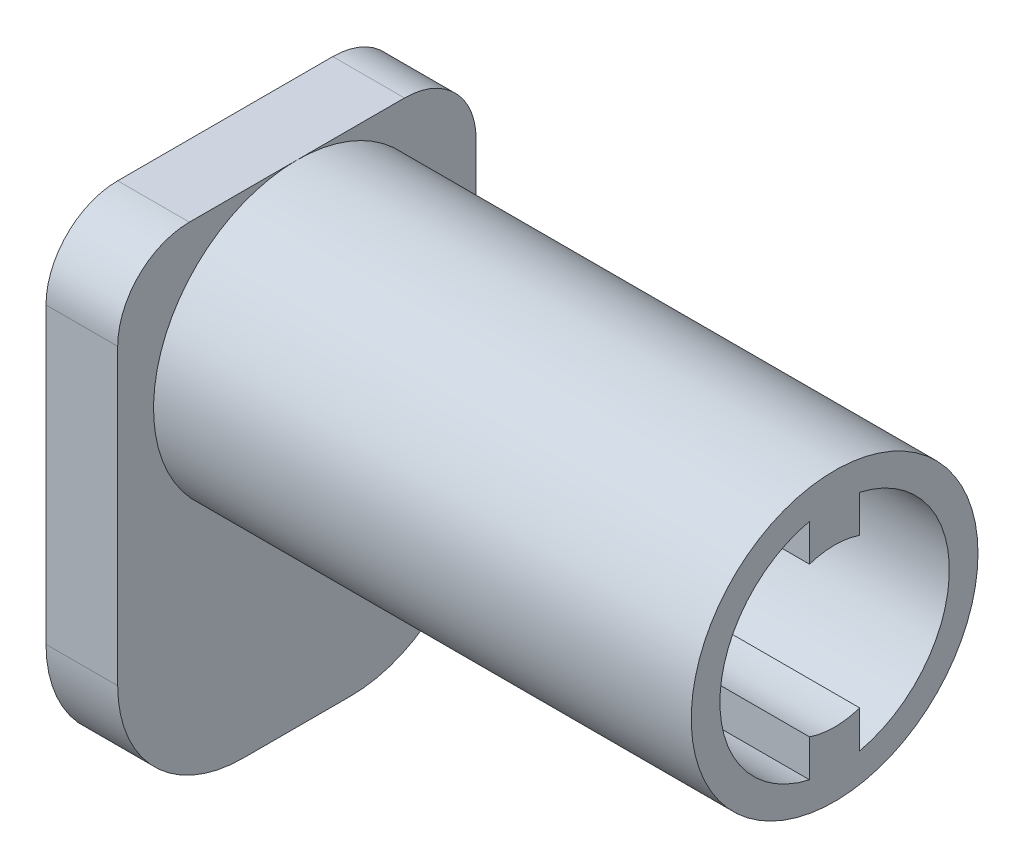
ISO-10303-21;
HEADER;
FILE_DESCRIPTION(('STEP AP214'),'2;1');
FILE_NAME('part.step','',(''),(''),'','','');
FILE_SCHEMA(('AUTOMOTIVE_DESIGN { 1 0 10303 214 1 1 1 1 }'));
ENDSEC;
DATA;
#1=APPLICATION_CONTEXT('core data for automotive mechanical design processes');
#2=APPLICATION_PROTOCOL_DEFINITION('international standard','automotive_design',2000,#1);
#3=PRODUCT_CONTEXT('',#1,'mechanical');
#4=PRODUCT('Part','Part','',(#3));
#5=PRODUCT_RELATED_PRODUCT_CATEGORY('part','',(#4));
#6=PRODUCT_DEFINITION_FORMATION('','',#4);
#7=PRODUCT_DEFINITION_CONTEXT('part definition',#1,'design');
#8=PRODUCT_DEFINITION('design','',#6,#7);
#9=PRODUCT_DEFINITION_SHAPE('','',#8);
#10=(LENGTH_UNIT() NAMED_UNIT(*) SI_UNIT(.MILLI.,.METRE.));
#11=(NAMED_UNIT(*) PLANE_ANGLE_UNIT() SI_UNIT($,.RADIAN.));
#12=(NAMED_UNIT(*) SI_UNIT($,.STERADIAN.) SOLID_ANGLE_UNIT());
#13=UNCERTAINTY_MEASURE_WITH_UNIT(LENGTH_MEASURE(1.E-05),#10,'distance_accuracy_value','');
#14=(GEOMETRIC_REPRESENTATION_CONTEXT(3) GLOBAL_UNCERTAINTY_ASSIGNED_CONTEXT((#13)) GLOBAL_UNIT_ASSIGNED_CONTEXT((#10,
#11,#12)) REPRESENTATION_CONTEXT('',''));
#15=CARTESIAN_POINT('',(0.,0.,0.));
#16=DIRECTION('',(0.,0.,1.));
#17=DIRECTION('',(1.,0.,0.));
#18=AXIS2_PLACEMENT_3D('',#15,#16,#17);
#19=CARTESIAN_POINT('',(-24.0509667991878,0.,0.));
#20=DIRECTION('',(1.,0.,0.));
#21=DIRECTION('',(0.,0.,-1.));
#22=AXIS2_PLACEMENT_3D('',#19,#20,#21);
#23=CYLINDRICAL_SURFACE('',#22,3.2);
#24=CARTESIAN_POINT('',(-15.,0.,0.));
#25=DIRECTION('',(-1.,0.,0.));
#26=DIRECTION('',(0.,0.,1.));
#27=AXIS2_PLACEMENT_3D('',#24,#25,#26);
#28=CIRCLE('',#27,3.2);
#29=CARTESIAN_POINT('',(-15.,3.1224989991992,0.7));
#30=VERTEX_POINT('',#29);
#31=CARTESIAN_POINT('',(-15.,-3.1224989991992,0.699999999999999));
#32=VERTEX_POINT('',#31);
#33=EDGE_CURVE('E165',#30,#32,#28,.F.);
#34=ORIENTED_EDGE('',*,*,#33,.F.);
#35=DIRECTION('',(-1.,0.,0.));
#36=VECTOR('',#35,1.);
#37=CARTESIAN_POINT('',(1.78934113199437,3.1224989991992,0.7));
#38=LINE('',#37,#36);
#39=CARTESIAN_POINT('',(0.,3.1224989991992,0.7));
#40=VERTEX_POINT('',#39);
#41=EDGE_CURVE('E152',#40,#30,#38,.T.);
#42=ORIENTED_EDGE('',*,*,#41,.F.);
#43=CARTESIAN_POINT('',(0.,0.,0.));
#44=DIRECTION('',(1.,0.,0.));
#45=DIRECTION('',(0.,0.,-1.));
#46=AXIS2_PLACEMENT_3D('',#43,#44,#45);
#47=CIRCLE('',#46,3.2);
#48=CARTESIAN_POINT('',(0.,-3.1224989991992,0.7));
#49=VERTEX_POINT('',#48);
#50=EDGE_CURVE('E163',#40,#49,#47,.T.);
#51=ORIENTED_EDGE('',*,*,#50,.T.);
#52=DIRECTION('',(-1.,0.,0.));
#53=VECTOR('',#52,1.);
#54=CARTESIAN_POINT('',(1.78934113199437,-3.1224989991992,0.7));
#55=LINE('',#54,#53);
#56=EDGE_CURVE('E338',#49,#32,#55,.T.);
#57=ORIENTED_EDGE('',*,*,#56,.T.);
#58=EDGE_LOOP('',(#34,#42,#51,#57));
#59=FACE_BOUND('',#58,.T.);
#60=ADVANCED_FACE('F31',(#59),#23,.F.);
#61=CARTESIAN_POINT('',(-15.,0.,0.));
#62=DIRECTION('',(1.,0.,0.));
#63=DIRECTION('',(0.,0.,-1.));
#64=AXIS2_PLACEMENT_3D('',#61,#62,#63);
#65=CYLINDRICAL_SURFACE('',#64,4.);
#66=CARTESIAN_POINT('',(-15.,0.,0.));
#67=DIRECTION('',(1.,0.,0.));
#68=DIRECTION('',(0.,0.,-1.));
#69=AXIS2_PLACEMENT_3D('',#66,#67,#68);
#70=CIRCLE('',#69,4.);
#71=CARTESIAN_POINT('',(-15.,4.,0.));
#72=VERTEX_POINT('',#71);
#73=EDGE_CURVE('E207',#72,#72,#70,.T.);
#74=ORIENTED_EDGE('',*,*,#73,.T.);
#75=EDGE_LOOP('',(#74));
#76=FACE_BOUND('',#75,.T.);
#77=CARTESIAN_POINT('',(0.,0.,0.));
#78=DIRECTION('',(1.,0.,0.));
#79=DIRECTION('',(0.,0.,-1.));
#80=AXIS2_PLACEMENT_3D('',#77,#78,#79);
#81=CIRCLE('',#80,4.);
#82=CARTESIAN_POINT('',(0.,0.,-4.));
#83=VERTEX_POINT('',#82);
#84=EDGE_CURVE('E198',#83,#83,#81,.T.);
#85=ORIENTED_EDGE('',*,*,#84,.F.);
#86=EDGE_LOOP('',(#85));
#87=FACE_BOUND('',#86,.T.);
#88=ADVANCED_FACE('F278',(#76,#87),#65,.T.);
#89=CARTESIAN_POINT('',(0.,0.,0.));
#90=DIRECTION('',(1.,0.,0.));
#91=DIRECTION('',(0.,0.,-1.));
#92=AXIS2_PLACEMENT_3D('',#89,#90,#91);
#93=PLANE('',#92);
#94=CARTESIAN_POINT('',(0.,-3.1224989991992,-0.7));
#95=VERTEX_POINT('',#94);
#96=CARTESIAN_POINT('',(0.,3.1224989991992,-0.700000000000001));
#97=VERTEX_POINT('',#96);
#98=EDGE_CURVE('E174',#95,#97,#47,.T.);
#99=ORIENTED_EDGE('',*,*,#98,.F.);
#100=DIRECTION('',(0.,-1.,0.));
#101=VECTOR('',#100,1.);
#102=CARTESIAN_POINT('',(0.,-2.86181760425084,-0.7));
#103=LINE('',#102,#101);
#104=CARTESIAN_POINT('',(0.,-2.08566536146142,-0.7));
#105=VERTEX_POINT('',#104);
#106=EDGE_CURVE('E312',#105,#95,#103,.T.);
#107=ORIENTED_EDGE('',*,*,#106,.F.);
#108=CARTESIAN_POINT('',(0.,0.,0.));
#109=DIRECTION('',(1.,0.,0.));
#110=DIRECTION('',(0.,0.,-1.));
#111=AXIS2_PLACEMENT_3D('',#108,#109,#110);
#112=CIRCLE('',#111,2.2);
#113=CARTESIAN_POINT('',(0.,-2.08566536146142,0.7));
#114=VERTEX_POINT('',#113);
#115=EDGE_CURVE('E333',#114,#105,#112,.T.);
#116=ORIENTED_EDGE('',*,*,#115,.F.);
#117=DIRECTION('',(0.,1.,0.));
#118=VECTOR('',#117,1.);
#119=CARTESIAN_POINT('',(0.,-2.86181760425084,0.699999999999999));
#120=LINE('',#119,#118);
#121=EDGE_CURVE('E172',#49,#114,#120,.T.);
#122=ORIENTED_EDGE('',*,*,#121,.F.);
#123=ORIENTED_EDGE('',*,*,#50,.F.);
#124=DIRECTION('',(0.,1.,0.));
#125=VECTOR('',#124,1.);
#126=CARTESIAN_POINT('',(0.,2.86181760425084,0.7));
#127=LINE('',#126,#125);
#128=CARTESIAN_POINT('',(0.,2.08566536146142,0.699999999999999));
#129=VERTEX_POINT('',#128);
#130=EDGE_CURVE('E149',#129,#40,#127,.T.);
#131=ORIENTED_EDGE('',*,*,#130,.F.);
#132=CARTESIAN_POINT('',(0.,0.,0.));
#133=DIRECTION('',(1.,0.,0.));
#134=DIRECTION('',(0.,0.,-1.));
#135=AXIS2_PLACEMENT_3D('',#132,#133,#134);
#136=CIRCLE('',#135,2.2);
#137=CARTESIAN_POINT('',(0.,2.08566536146142,-0.700000000000001));
#138=VERTEX_POINT('',#137);
#139=EDGE_CURVE('E316',#138,#129,#136,.T.);
#140=ORIENTED_EDGE('',*,*,#139,.F.);
#141=DIRECTION('',(0.,-1.,0.));
#142=VECTOR('',#141,1.);
#143=CARTESIAN_POINT('',(0.,2.08566536146142,-0.700000000000001));
#144=LINE('',#143,#142);
#145=EDGE_CURVE('E315',#97,#138,#144,.T.);
#146=ORIENTED_EDGE('',*,*,#145,.F.);
#147=EDGE_LOOP('',(#99,#107,#116,#122,#123,#131,#140,#146));
#148=FACE_BOUND('',#147,.T.);
#149=ORIENTED_EDGE('',*,*,#84,.T.);
#150=EDGE_LOOP('',(#149));
#151=FACE_BOUND('',#150,.T.);
#152=ADVANCED_FACE('F169',(#148,#151),#93,.T.);
#153=CARTESIAN_POINT('',(-17.,4.,-5.));
#154=DIRECTION('',(0.,0.,1.));
#155=DIRECTION('',(0.,-1.,0.));
#156=AXIS2_PLACEMENT_3D('',#153,#154,#155);
#157=PLANE('',#156);
#158=DIRECTION('',(0.,-1.,0.));
#159=VECTOR('',#158,1.);
#160=CARTESIAN_POINT('',(-15.,4.,-5.));
#161=LINE('',#160,#159);
#162=CARTESIAN_POINT('',(-15.,2.,-5.));
#163=VERTEX_POINT('',#162);
#164=CARTESIAN_POINT('',(-15.,-6.2,-5.));
#165=VERTEX_POINT('',#164);
#166=EDGE_CURVE('E187',#163,#165,#161,.T.);
#167=ORIENTED_EDGE('',*,*,#166,.T.);
#168=DIRECTION('',(1.,0.,0.));
#169=VECTOR('',#168,1.);
#170=CARTESIAN_POINT('',(-17.,-6.2,-5.));
#171=LINE('',#170,#169);
#172=CARTESIAN_POINT('',(-17.,-6.2,-5.));
#173=VERTEX_POINT('',#172);
#174=EDGE_CURVE('E54',#165,#173,#171,.F.);
#175=ORIENTED_EDGE('',*,*,#174,.T.);
#176=DIRECTION('',(0.,-1.,0.));
#177=VECTOR('',#176,1.);
#178=CARTESIAN_POINT('',(-17.,4.,-5.));
#179=LINE('',#178,#177);
#180=CARTESIAN_POINT('',(-17.,2.,-5.));
#181=VERTEX_POINT('',#180);
#182=EDGE_CURVE('E188',#181,#173,#179,.T.);
#183=ORIENTED_EDGE('',*,*,#182,.F.);
#184=DIRECTION('',(1.,0.,0.));
#185=VECTOR('',#184,1.);
#186=CARTESIAN_POINT('',(-17.,2.,-5.));
#187=LINE('',#186,#185);
#188=EDGE_CURVE('E235',#181,#163,#187,.T.);
#189=ORIENTED_EDGE('',*,*,#188,.T.);
#190=EDGE_LOOP('',(#167,#175,#183,#189));
#191=FACE_BOUND('',#190,.T.);
#192=ADVANCED_FACE('F261',(#191),#157,.F.);
#193=CARTESIAN_POINT('',(-17.,-9.7,-5.));
#194=DIRECTION('',(0.,1.,0.));
#195=DIRECTION('',(0.,0.,1.));
#196=AXIS2_PLACEMENT_3D('',#193,#194,#195);
#197=PLANE('',#196);
#198=DIRECTION('',(0.,0.,1.));
#199=VECTOR('',#198,1.);
#200=CARTESIAN_POINT('',(-17.,-9.7,-5.));
#201=LINE('',#200,#199);
#202=CARTESIAN_POINT('',(-17.,-9.7,-1.5));
#203=VERTEX_POINT('',#202);
#204=CARTESIAN_POINT('',(-17.,-9.7,1.5));
#205=VERTEX_POINT('',#204);
#206=EDGE_CURVE('E190',#203,#205,#201,.T.);
#207=ORIENTED_EDGE('',*,*,#206,.F.);
#208=DIRECTION('',(1.,0.,0.));
#209=VECTOR('',#208,1.);
#210=CARTESIAN_POINT('',(-17.,-9.7,-1.5));
#211=LINE('',#210,#209);
#212=CARTESIAN_POINT('',(-15.,-9.7,-1.5));
#213=VERTEX_POINT('',#212);
#214=EDGE_CURVE('E240',#203,#213,#211,.T.);
#215=ORIENTED_EDGE('',*,*,#214,.T.);
#216=DIRECTION('',(0.,0.,1.));
#217=VECTOR('',#216,1.);
#218=CARTESIAN_POINT('',(-15.,-9.7,-5.));
#219=LINE('',#218,#217);
#220=CARTESIAN_POINT('',(-15.,-9.7,1.5));
#221=VERTEX_POINT('',#220);
#222=EDGE_CURVE('E200',#213,#221,#219,.T.);
#223=ORIENTED_EDGE('',*,*,#222,.T.);
#224=DIRECTION('',(1.,0.,0.));
#225=VECTOR('',#224,1.);
#226=CARTESIAN_POINT('',(-17.,-9.7,1.5));
#227=LINE('',#226,#225);
#228=EDGE_CURVE('E238',#221,#205,#227,.F.);
#229=ORIENTED_EDGE('',*,*,#228,.T.);
#230=EDGE_LOOP('',(#207,#215,#223,#229));
#231=FACE_BOUND('',#230,.T.);
#232=ADVANCED_FACE('F254',(#231),#197,.F.);
#233=CARTESIAN_POINT('',(-17.,4.,5.));
#234=DIRECTION('',(0.,0.,-1.));
#235=DIRECTION('',(0.,1.,0.));
#236=AXIS2_PLACEMENT_3D('',#233,#234,#235);
#237=PLANE('',#236);
#238=DIRECTION('',(0.,1.,0.));
#239=VECTOR('',#238,1.);
#240=CARTESIAN_POINT('',(-17.,4.,5.));
#241=LINE('',#240,#239);
#242=CARTESIAN_POINT('',(-17.,-6.2,5.));
#243=VERTEX_POINT('',#242);
#244=CARTESIAN_POINT('',(-17.,2.,5.));
#245=VERTEX_POINT('',#244);
#246=EDGE_CURVE('E193',#243,#245,#241,.T.);
#247=ORIENTED_EDGE('',*,*,#246,.F.);
#248=DIRECTION('',(1.,0.,0.));
#249=VECTOR('',#248,1.);
#250=CARTESIAN_POINT('',(-17.,-6.2,5.));
#251=LINE('',#250,#249);
#252=CARTESIAN_POINT('',(-15.,-6.2,5.));
#253=VERTEX_POINT('',#252);
#254=EDGE_CURVE('E11',#243,#253,#251,.T.);
#255=ORIENTED_EDGE('',*,*,#254,.T.);
#256=DIRECTION('',(0.,1.,0.));
#257=VECTOR('',#256,1.);
#258=CARTESIAN_POINT('',(-15.,4.,5.));
#259=LINE('',#258,#257);
#260=CARTESIAN_POINT('',(-15.,2.,5.));
#261=VERTEX_POINT('',#260);
#262=EDGE_CURVE('E203',#253,#261,#259,.T.);
#263=ORIENTED_EDGE('',*,*,#262,.T.);
#264=DIRECTION('',(1.,0.,0.));
#265=VECTOR('',#264,1.);
#266=CARTESIAN_POINT('',(-17.,2.,5.));
#267=LINE('',#266,#265);
#268=EDGE_CURVE('E228',#261,#245,#267,.F.);
#269=ORIENTED_EDGE('',*,*,#268,.T.);
#270=EDGE_LOOP('',(#247,#255,#263,#269));
#271=FACE_BOUND('',#270,.T.);
#272=ADVANCED_FACE('F361',(#271),#237,.F.);
#273=CARTESIAN_POINT('',(-17.,4.,-5.));
#274=DIRECTION('',(0.,-1.,0.));
#275=DIRECTION('',(0.,0.,-1.));
#276=AXIS2_PLACEMENT_3D('',#273,#274,#275);
#277=PLANE('',#276);
#278=DIRECTION('',(0.,0.,-1.));
#279=VECTOR('',#278,1.);
#280=CARTESIAN_POINT('',(-17.,4.,-5.));
#281=LINE('',#280,#279);
#282=CARTESIAN_POINT('',(-17.,4.,3.));
#283=VERTEX_POINT('',#282);
#284=CARTESIAN_POINT('',(-17.,4.,-3.));
#285=VERTEX_POINT('',#284);
#286=EDGE_CURVE('E195',#283,#285,#281,.T.);
#287=ORIENTED_EDGE('',*,*,#286,.F.);
#288=DIRECTION('',(1.,0.,0.));
#289=VECTOR('',#288,1.);
#290=CARTESIAN_POINT('',(-17.,4.,3.));
#291=LINE('',#290,#289);
#292=CARTESIAN_POINT('',(-15.,4.,3.));
#293=VERTEX_POINT('',#292);
#294=EDGE_CURVE('E220',#283,#293,#291,.T.);
#295=ORIENTED_EDGE('',*,*,#294,.T.);
#296=DIRECTION('',(0.,0.,-1.));
#297=VECTOR('',#296,1.);
#298=CARTESIAN_POINT('',(-15.,4.,-5.));
#299=LINE('',#298,#297);
#300=EDGE_CURVE('E191',#293,#72,#299,.T.);
#301=ORIENTED_EDGE('',*,*,#300,.T.);
#302=CARTESIAN_POINT('',(-15.,4.,-3.));
#303=VERTEX_POINT('',#302);
#304=EDGE_CURVE('E205',#72,#303,#299,.T.);
#305=ORIENTED_EDGE('',*,*,#304,.T.);
#306=DIRECTION('',(1.,0.,0.));
#307=VECTOR('',#306,1.);
#308=CARTESIAN_POINT('',(-17.,4.,-3.));
#309=LINE('',#308,#307);
#310=EDGE_CURVE('E218',#303,#285,#309,.F.);
#311=ORIENTED_EDGE('',*,*,#310,.T.);
#312=EDGE_LOOP('',(#287,#295,#301,#305,#311));
#313=FACE_BOUND('',#312,.T.);
#314=ADVANCED_FACE('F272',(#313),#277,.F.);
#315=CARTESIAN_POINT('',(-17.,-9.7,-5.));
#316=DIRECTION('',(-1.,0.,0.));
#317=DIRECTION('',(0.,0.,1.));
#318=AXIS2_PLACEMENT_3D('',#315,#316,#317);
#319=PLANE('',#318);
#320=CARTESIAN_POINT('',(-17.,0.,0.));
#321=DIRECTION('',(-1.,0.,0.));
#322=DIRECTION('',(0.,0.,1.));
#323=AXIS2_PLACEMENT_3D('',#320,#321,#322);
#324=CIRCLE('',#323,1.6);
#325=CARTESIAN_POINT('',(-17.,0.,1.6));
#326=VERTEX_POINT('',#325);
#327=EDGE_CURVE('E179',#326,#326,#324,.T.);
#328=ORIENTED_EDGE('',*,*,#327,.F.);
#329=EDGE_LOOP('',(#328));
#330=FACE_BOUND('',#329,.T.);
#331=ORIENTED_EDGE('',*,*,#182,.T.);
#332=CARTESIAN_POINT('',(-17.,-6.2,-1.5));
#333=DIRECTION('',(-1.,0.,0.));
#334=DIRECTION('',(0.,0.,1.));
#335=AXIS2_PLACEMENT_3D('',#332,#333,#334);
#336=CIRCLE('',#335,3.5);
#337=EDGE_CURVE('E39',#173,#203,#336,.T.);
#338=ORIENTED_EDGE('',*,*,#337,.T.);
#339=ORIENTED_EDGE('',*,*,#206,.T.);
#340=CARTESIAN_POINT('',(-17.,-6.2,1.5));
#341=DIRECTION('',(-1.,0.,0.));
#342=DIRECTION('',(0.,0.,1.));
#343=AXIS2_PLACEMENT_3D('',#340,#341,#342);
#344=CIRCLE('',#343,3.5);
#345=EDGE_CURVE('E46',#205,#243,#344,.T.);
#346=ORIENTED_EDGE('',*,*,#345,.T.);
#347=ORIENTED_EDGE('',*,*,#246,.T.);
#348=CARTESIAN_POINT('',(-17.,2.,3.));
#349=DIRECTION('',(-1.,0.,0.));
#350=DIRECTION('',(0.,0.,1.));
#351=AXIS2_PLACEMENT_3D('',#348,#349,#350);
#352=CIRCLE('',#351,2.);
#353=EDGE_CURVE('E233',#245,#283,#352,.T.);
#354=ORIENTED_EDGE('',*,*,#353,.T.);
#355=ORIENTED_EDGE('',*,*,#286,.T.);
#356=CARTESIAN_POINT('',(-17.,2.,-3.));
#357=DIRECTION('',(-1.,0.,0.));
#358=DIRECTION('',(0.,0.,1.));
#359=AXIS2_PLACEMENT_3D('',#356,#357,#358);
#360=CIRCLE('',#359,2.);
#361=EDGE_CURVE('E231',#285,#181,#360,.T.);
#362=ORIENTED_EDGE('',*,*,#361,.T.);
#363=EDGE_LOOP('',(#331,#338,#339,#346,#347,#354,#355,#362));
#364=FACE_BOUND('',#363,.T.);
#365=ADVANCED_FACE('F250',(#330,#364),#319,.T.);
#366=CARTESIAN_POINT('',(-15.,-9.7,-5.));
#367=DIRECTION('',(-1.,0.,0.));
#368=DIRECTION('',(0.,0.,1.));
#369=AXIS2_PLACEMENT_3D('',#366,#367,#368);
#370=PLANE('',#369);
#371=ORIENTED_EDGE('',*,*,#222,.F.);
#372=CARTESIAN_POINT('',(-15.,-6.2,-1.5));
#373=DIRECTION('',(-1.,0.,0.));
#374=DIRECTION('',(0.,0.,1.));
#375=AXIS2_PLACEMENT_3D('',#372,#373,#374);
#376=CIRCLE('',#375,3.5);
#377=EDGE_CURVE('E245',#213,#165,#376,.F.);
#378=ORIENTED_EDGE('',*,*,#377,.T.);
#379=ORIENTED_EDGE('',*,*,#166,.F.);
#380=CARTESIAN_POINT('',(-15.,2.,-3.));
#381=DIRECTION('',(-1.,0.,0.));
#382=DIRECTION('',(0.,0.,1.));
#383=AXIS2_PLACEMENT_3D('',#380,#381,#382);
#384=CIRCLE('',#383,2.);
#385=EDGE_CURVE('E223',#163,#303,#384,.F.);
#386=ORIENTED_EDGE('',*,*,#385,.T.);
#387=ORIENTED_EDGE('',*,*,#304,.F.);
#388=ORIENTED_EDGE('',*,*,#73,.F.);
#389=ORIENTED_EDGE('',*,*,#300,.F.);
#390=CARTESIAN_POINT('',(-15.,2.,3.));
#391=DIRECTION('',(-1.,0.,0.));
#392=DIRECTION('',(0.,0.,1.));
#393=AXIS2_PLACEMENT_3D('',#390,#391,#392);
#394=CIRCLE('',#393,2.);
#395=EDGE_CURVE('E225',#293,#261,#394,.F.);
#396=ORIENTED_EDGE('',*,*,#395,.T.);
#397=ORIENTED_EDGE('',*,*,#262,.F.);
#398=CARTESIAN_POINT('',(-15.,-6.2,1.5));
#399=DIRECTION('',(-1.,0.,0.));
#400=DIRECTION('',(0.,0.,1.));
#401=AXIS2_PLACEMENT_3D('',#398,#399,#400);
#402=CIRCLE('',#401,3.5);
#403=EDGE_CURVE('E243',#253,#221,#402,.F.);
#404=ORIENTED_EDGE('',*,*,#403,.T.);
#405=EDGE_LOOP('',(#371,#378,#379,#386,#387,#388,#389,#396,#397,#404));
#406=FACE_BOUND('',#405,.T.);
#407=ADVANCED_FACE('F260',(#406),#370,.F.);
#408=CARTESIAN_POINT('',(-15.,-9.7,-5.));
#409=DIRECTION('',(-1.,0.,0.));
#410=DIRECTION('',(0.,0.,1.));
#411=AXIS2_PLACEMENT_3D('',#408,#409,#410);
#412=PLANE('',#411);
#413=CARTESIAN_POINT('',(-15.,0.,0.));
#414=DIRECTION('',(-1.,0.,0.));
#415=DIRECTION('',(0.,0.,1.));
#416=AXIS2_PLACEMENT_3D('',#413,#414,#415);
#417=CIRCLE('',#416,1.6);
#418=CARTESIAN_POINT('',(-15.,0.,1.6));
#419=VERTEX_POINT('',#418);
#420=EDGE_CURVE('E175',#419,#419,#417,.T.);
#421=ORIENTED_EDGE('',*,*,#420,.T.);
#422=EDGE_LOOP('',(#421));
#423=FACE_BOUND('',#422,.T.);
#424=CARTESIAN_POINT('',(-15.,0.,0.));
#425=DIRECTION('',(-1.,0.,0.));
#426=DIRECTION('',(0.,0.,1.));
#427=AXIS2_PLACEMENT_3D('',#424,#425,#426);
#428=CIRCLE('',#427,2.2);
#429=CARTESIAN_POINT('',(-15.,2.08566536146142,-0.700000000000001));
#430=VERTEX_POINT('',#429);
#431=CARTESIAN_POINT('',(-15.,2.08566536146142,0.7));
#432=VERTEX_POINT('',#431);
#433=EDGE_CURVE('E215',#430,#432,#428,.F.);
#434=ORIENTED_EDGE('',*,*,#433,.T.);
#435=DIRECTION('',(0.,1.,0.));
#436=VECTOR('',#435,1.);
#437=CARTESIAN_POINT('',(-15.,-9.7,0.699999999999989));
#438=LINE('',#437,#436);
#439=EDGE_CURVE('E330',#432,#30,#438,.T.);
#440=ORIENTED_EDGE('',*,*,#439,.T.);
#441=ORIENTED_EDGE('',*,*,#33,.T.);
#442=DIRECTION('',(0.,1.,0.));
#443=VECTOR('',#442,1.);
#444=CARTESIAN_POINT('',(-15.,-9.7,0.699999999999993));
#445=LINE('',#444,#443);
#446=CARTESIAN_POINT('',(-15.,-2.08566536146142,0.7));
#447=VERTEX_POINT('',#446);
#448=EDGE_CURVE('E345',#32,#447,#445,.T.);
#449=ORIENTED_EDGE('',*,*,#448,.T.);
#450=CARTESIAN_POINT('',(-15.,0.,0.));
#451=DIRECTION('',(-1.,0.,0.));
#452=DIRECTION('',(0.,0.,1.));
#453=AXIS2_PLACEMENT_3D('',#450,#451,#452);
#454=CIRCLE('',#453,2.2);
#455=CARTESIAN_POINT('',(-15.,-2.08566536146142,-0.700000000000001));
#456=VERTEX_POINT('',#455);
#457=EDGE_CURVE('E210',#447,#456,#454,.F.);
#458=ORIENTED_EDGE('',*,*,#457,.T.);
#459=DIRECTION('',(0.,-1.,0.));
#460=VECTOR('',#459,1.);
#461=CARTESIAN_POINT('',(-15.,-9.7,-0.700000000000006));
#462=LINE('',#461,#460);
#463=CARTESIAN_POINT('',(-15.,-3.1224989991992,-0.7));
#464=VERTEX_POINT('',#463);
#465=EDGE_CURVE('E347',#456,#464,#462,.T.);
#466=ORIENTED_EDGE('',*,*,#465,.T.);
#467=CARTESIAN_POINT('',(-15.,3.1224989991992,-0.7));
#468=VERTEX_POINT('',#467);
#469=EDGE_CURVE('E184',#464,#468,#28,.F.);
#470=ORIENTED_EDGE('',*,*,#469,.T.);
#471=DIRECTION('',(0.,-1.,0.));
#472=VECTOR('',#471,1.);
#473=CARTESIAN_POINT('',(-15.,-9.7,-0.700000000000006));
#474=LINE('',#473,#472);
#475=EDGE_CURVE('E324',#468,#430,#474,.T.);
#476=ORIENTED_EDGE('',*,*,#475,.T.);
#477=EDGE_LOOP('',(#434,#440,#441,#449,#458,#466,#470,#476));
#478=FACE_BOUND('',#477,.T.);
#479=ADVANCED_FACE('F298',(#423,#478),#412,.F.);
#480=ORIENTED_EDGE('',*,*,#98,.T.);
#481=DIRECTION('',(-1.,0.,0.));
#482=VECTOR('',#481,1.);
#483=CARTESIAN_POINT('',(1.78934113199437,3.1224989991992,-0.700000000000001));
#484=LINE('',#483,#482);
#485=EDGE_CURVE('E166',#97,#468,#484,.T.);
#486=ORIENTED_EDGE('',*,*,#485,.T.);
#487=ORIENTED_EDGE('',*,*,#469,.F.);
#488=DIRECTION('',(-1.,0.,0.));
#489=VECTOR('',#488,1.);
#490=CARTESIAN_POINT('',(1.78934113199437,-3.1224989991992,-0.7));
#491=LINE('',#490,#489);
#492=EDGE_CURVE('E311',#95,#464,#491,.T.);
#493=ORIENTED_EDGE('',*,*,#492,.F.);
#494=EDGE_LOOP('',(#480,#486,#487,#493));
#495=FACE_BOUND('',#494,.T.);
#496=ADVANCED_FACE('F291',(#495),#23,.F.);
#497=CARTESIAN_POINT('',(0.,0.,0.));
#498=DIRECTION('',(-1.,0.,0.));
#499=DIRECTION('',(0.,0.,1.));
#500=AXIS2_PLACEMENT_3D('',#497,#498,#499);
#501=CYLINDRICAL_SURFACE('',#500,1.6);
#502=ORIENTED_EDGE('',*,*,#327,.T.);
#503=EDGE_LOOP('',(#502));
#504=FACE_BOUND('',#503,.T.);
#505=ORIENTED_EDGE('',*,*,#420,.F.);
#506=EDGE_LOOP('',(#505));
#507=FACE_BOUND('',#506,.T.);
#508=ADVANCED_FACE('F297',(#504,#507),#501,.F.);
#509=CARTESIAN_POINT('',(1.78934113199437,0.,0.));
#510=DIRECTION('',(-1.,0.,0.));
#511=DIRECTION('',(0.,0.,1.));
#512=AXIS2_PLACEMENT_3D('',#509,#510,#511);
#513=CYLINDRICAL_SURFACE('',#512,2.2);
#514=ORIENTED_EDGE('',*,*,#457,.F.);
#515=DIRECTION('',(-1.,0.,0.));
#516=VECTOR('',#515,1.);
#517=CARTESIAN_POINT('',(1.78934113199437,-2.08566536146142,0.7));
#518=LINE('',#517,#516);
#519=EDGE_CURVE('E336',#114,#447,#518,.T.);
#520=ORIENTED_EDGE('',*,*,#519,.F.);
#521=ORIENTED_EDGE('',*,*,#115,.T.);
#522=DIRECTION('',(-1.,0.,0.));
#523=VECTOR('',#522,1.);
#524=CARTESIAN_POINT('',(1.78934113199437,-2.08566536146142,-0.700000000000001));
#525=LINE('',#524,#523);
#526=EDGE_CURVE('E335',#105,#456,#525,.T.);
#527=ORIENTED_EDGE('',*,*,#526,.T.);
#528=EDGE_LOOP('',(#514,#520,#521,#527));
#529=FACE_BOUND('',#528,.T.);
#530=ADVANCED_FACE('F304',(#529),#513,.F.);
#531=CARTESIAN_POINT('',(1.78934113199437,-2.86181760425084,-0.7));
#532=DIRECTION('',(0.,0.,-1.));
#533=DIRECTION('',(0.,1.,0.));
#534=AXIS2_PLACEMENT_3D('',#531,#532,#533);
#535=PLANE('',#534);
#536=ORIENTED_EDGE('',*,*,#465,.F.);
#537=ORIENTED_EDGE('',*,*,#526,.F.);
#538=ORIENTED_EDGE('',*,*,#106,.T.);
#539=ORIENTED_EDGE('',*,*,#492,.T.);
#540=EDGE_LOOP('',(#536,#537,#538,#539));
#541=FACE_BOUND('',#540,.T.);
#542=ADVANCED_FACE('F460',(#541),#535,.T.);
#543=CARTESIAN_POINT('',(1.78934113199437,-2.86181760425084,0.699999999999999));
#544=DIRECTION('',(0.,0.,1.));
#545=DIRECTION('',(0.,-1.,0.));
#546=AXIS2_PLACEMENT_3D('',#543,#544,#545);
#547=PLANE('',#546);
#548=ORIENTED_EDGE('',*,*,#448,.F.);
#549=ORIENTED_EDGE('',*,*,#56,.F.);
#550=ORIENTED_EDGE('',*,*,#121,.T.);
#551=ORIENTED_EDGE('',*,*,#519,.T.);
#552=EDGE_LOOP('',(#548,#549,#550,#551));
#553=FACE_BOUND('',#552,.T.);
#554=ADVANCED_FACE('F471',(#553),#547,.T.);
#555=CARTESIAN_POINT('',(1.78934113199437,0.,0.));
#556=DIRECTION('',(-1.,0.,0.));
#557=DIRECTION('',(0.,0.,1.));
#558=AXIS2_PLACEMENT_3D('',#555,#556,#557);
#559=CYLINDRICAL_SURFACE('',#558,2.2);
#560=ORIENTED_EDGE('',*,*,#433,.F.);
#561=DIRECTION('',(-1.,0.,0.));
#562=VECTOR('',#561,1.);
#563=CARTESIAN_POINT('',(1.78934113199437,2.08566536146142,-0.700000000000001));
#564=LINE('',#563,#562);
#565=EDGE_CURVE('E320',#138,#430,#564,.T.);
#566=ORIENTED_EDGE('',*,*,#565,.F.);
#567=ORIENTED_EDGE('',*,*,#139,.T.);
#568=DIRECTION('',(-1.,0.,0.));
#569=VECTOR('',#568,1.);
#570=CARTESIAN_POINT('',(1.78934113199437,2.08566536146142,0.7));
#571=LINE('',#570,#569);
#572=EDGE_CURVE('E155',#129,#432,#571,.T.);
#573=ORIENTED_EDGE('',*,*,#572,.T.);
#574=EDGE_LOOP('',(#560,#566,#567,#573));
#575=FACE_BOUND('',#574,.T.);
#576=ADVANCED_FACE('F482',(#575),#559,.F.);
#577=CARTESIAN_POINT('',(1.78934113199437,2.86181760425084,0.7));
#578=DIRECTION('',(0.,0.,1.));
#579=DIRECTION('',(0.,-1.,0.));
#580=AXIS2_PLACEMENT_3D('',#577,#578,#579);
#581=PLANE('',#580);
#582=ORIENTED_EDGE('',*,*,#439,.F.);
#583=ORIENTED_EDGE('',*,*,#572,.F.);
#584=ORIENTED_EDGE('',*,*,#130,.T.);
#585=ORIENTED_EDGE('',*,*,#41,.T.);
#586=EDGE_LOOP('',(#582,#583,#584,#585));
#587=FACE_BOUND('',#586,.T.);
#588=ADVANCED_FACE('F151',(#587),#581,.T.);
#589=CARTESIAN_POINT('',(1.78934113199437,2.08566536146142,-0.700000000000001));
#590=DIRECTION('',(0.,0.,-1.));
#591=DIRECTION('',(0.,1.,0.));
#592=AXIS2_PLACEMENT_3D('',#589,#590,#591);
#593=PLANE('',#592);
#594=ORIENTED_EDGE('',*,*,#475,.F.);
#595=ORIENTED_EDGE('',*,*,#485,.F.);
#596=ORIENTED_EDGE('',*,*,#145,.T.);
#597=ORIENTED_EDGE('',*,*,#565,.T.);
#598=EDGE_LOOP('',(#594,#595,#596,#597));
#599=FACE_BOUND('',#598,.T.);
#600=ADVANCED_FACE('F322',(#599),#593,.T.);
#601=CARTESIAN_POINT('',(-17.,2.,3.));
#602=DIRECTION('',(1.,0.,0.));
#603=DIRECTION('',(0.,0.,-1.));
#604=AXIS2_PLACEMENT_3D('',#601,#602,#603);
#605=CYLINDRICAL_SURFACE('',#604,2.);
#606=ORIENTED_EDGE('',*,*,#353,.F.);
#607=ORIENTED_EDGE('',*,*,#268,.F.);
#608=ORIENTED_EDGE('',*,*,#395,.F.);
#609=ORIENTED_EDGE('',*,*,#294,.F.);
#610=EDGE_LOOP('',(#606,#607,#608,#609));
#611=FACE_BOUND('',#610,.T.);
#612=ADVANCED_FACE('F391',(#611),#605,.T.);
#613=CARTESIAN_POINT('',(-17.,2.,-3.));
#614=DIRECTION('',(1.,0.,0.));
#615=DIRECTION('',(0.,0.,-1.));
#616=AXIS2_PLACEMENT_3D('',#613,#614,#615);
#617=CYLINDRICAL_SURFACE('',#616,2.);
#618=ORIENTED_EDGE('',*,*,#361,.F.);
#619=ORIENTED_EDGE('',*,*,#310,.F.);
#620=ORIENTED_EDGE('',*,*,#385,.F.);
#621=ORIENTED_EDGE('',*,*,#188,.F.);
#622=EDGE_LOOP('',(#618,#619,#620,#621));
#623=FACE_BOUND('',#622,.T.);
#624=ADVANCED_FACE('F265',(#623),#617,.T.);
#625=CARTESIAN_POINT('',(-17.,-6.2,-1.5));
#626=DIRECTION('',(1.,0.,0.));
#627=DIRECTION('',(0.,0.,-1.));
#628=AXIS2_PLACEMENT_3D('',#625,#626,#627);
#629=CYLINDRICAL_SURFACE('',#628,3.5);
#630=ORIENTED_EDGE('',*,*,#337,.F.);
#631=ORIENTED_EDGE('',*,*,#174,.F.);
#632=ORIENTED_EDGE('',*,*,#377,.F.);
#633=ORIENTED_EDGE('',*,*,#214,.F.);
#634=EDGE_LOOP('',(#630,#631,#632,#633));
#635=FACE_BOUND('',#634,.T.);
#636=ADVANCED_FACE('F257',(#635),#629,.T.);
#637=CARTESIAN_POINT('',(-17.,-6.2,1.5));
#638=DIRECTION('',(1.,0.,0.));
#639=DIRECTION('',(0.,0.,-1.));
#640=AXIS2_PLACEMENT_3D('',#637,#638,#639);
#641=CYLINDRICAL_SURFACE('',#640,3.5);
#642=ORIENTED_EDGE('',*,*,#345,.F.);
#643=ORIENTED_EDGE('',*,*,#228,.F.);
#644=ORIENTED_EDGE('',*,*,#403,.F.);
#645=ORIENTED_EDGE('',*,*,#254,.F.);
#646=EDGE_LOOP('',(#642,#643,#644,#645));
#647=FACE_BOUND('',#646,.T.);
#648=ADVANCED_FACE('F33',(#647),#641,.T.);
#649=CLOSED_SHELL('',(#60,#88,#152,#192,#232,#272,#314,#365,#407,#479,#496,#508,#530,#542,#554,
#576,#588,#600,#612,#624,#636,#648));
#650=MANIFOLD_SOLID_BREP('B2',#649);
#651=ADVANCED_BREP_SHAPE_REPRESENTATION('',(#18,#650),#14);
#652=SHAPE_DEFINITION_REPRESENTATION(#9,#651);
ENDSEC;
END-ISO-10303-21;
